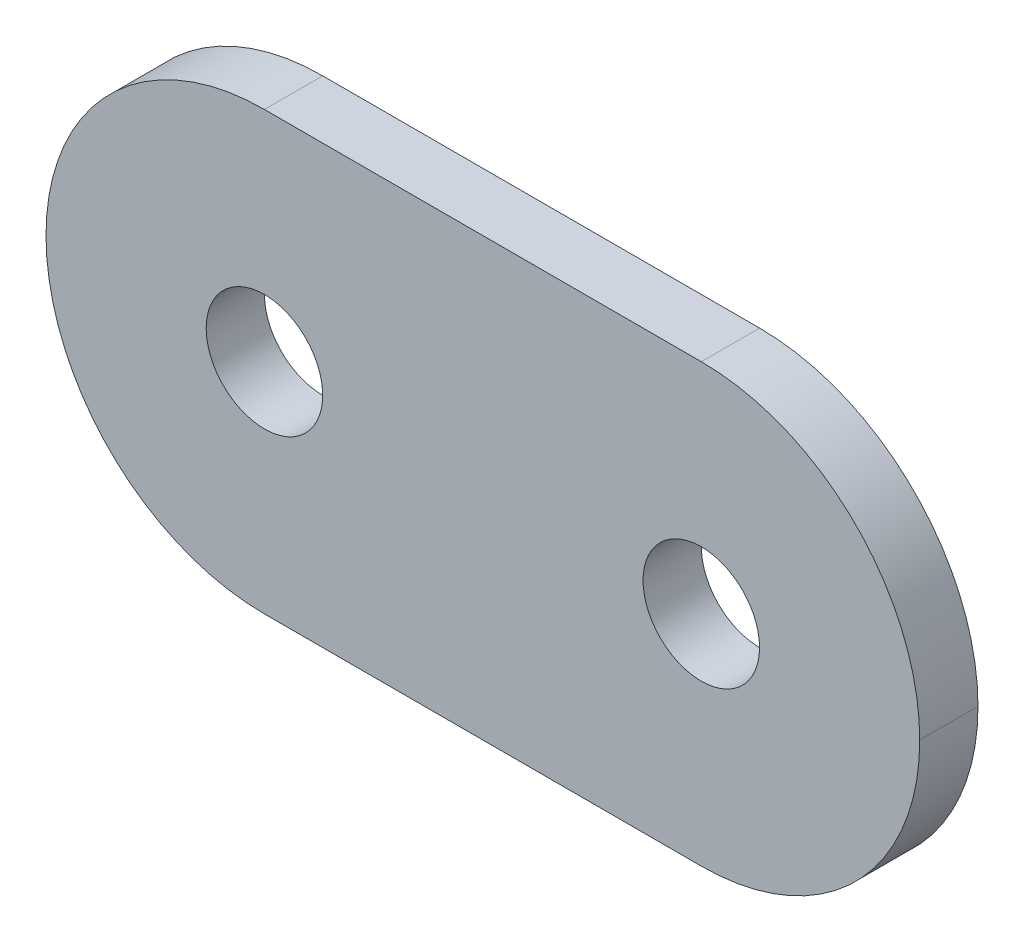
ISO-10303-21;
HEADER;
FILE_DESCRIPTION(('STEP AP214'),'2;1');
FILE_NAME('part.step','',(''),(''),'','','');
FILE_SCHEMA(('AUTOMOTIVE_DESIGN { 1 0 10303 214 1 1 1 1 }'));
ENDSEC;
DATA;
#1=APPLICATION_CONTEXT('core data for automotive mechanical design processes');
#2=APPLICATION_PROTOCOL_DEFINITION('international standard','automotive_design',2000,#1);
#3=PRODUCT_CONTEXT('',#1,'mechanical');
#4=PRODUCT('Part','Part','',(#3));
#5=PRODUCT_RELATED_PRODUCT_CATEGORY('part','',(#4));
#6=PRODUCT_DEFINITION_FORMATION('','',#4);
#7=PRODUCT_DEFINITION_CONTEXT('part definition',#1,'design');
#8=PRODUCT_DEFINITION('design','',#6,#7);
#9=PRODUCT_DEFINITION_SHAPE('','',#8);
#10=(LENGTH_UNIT() NAMED_UNIT(*) SI_UNIT(.MILLI.,.METRE.));
#11=(NAMED_UNIT(*) PLANE_ANGLE_UNIT() SI_UNIT($,.RADIAN.));
#12=(NAMED_UNIT(*) SI_UNIT($,.STERADIAN.) SOLID_ANGLE_UNIT());
#13=UNCERTAINTY_MEASURE_WITH_UNIT(LENGTH_MEASURE(1.E-05),#10,'distance_accuracy_value','');
#14=(GEOMETRIC_REPRESENTATION_CONTEXT(3) GLOBAL_UNCERTAINTY_ASSIGNED_CONTEXT((#13)) GLOBAL_UNIT_ASSIGNED_CONTEXT((#10,
#11,#12)) REPRESENTATION_CONTEXT('',''));
#15=CARTESIAN_POINT('',(0.,0.,0.));
#16=DIRECTION('',(0.,0.,1.));
#17=DIRECTION('',(1.,0.,0.));
#18=AXIS2_PLACEMENT_3D('',#15,#16,#17);
#19=CARTESIAN_POINT('',(-15.,7.5,2.));
#20=DIRECTION('',(0.,-1.,0.));
#21=DIRECTION('',(0.,0.,-1.));
#22=AXIS2_PLACEMENT_3D('',#19,#20,#21);
#23=PLANE('',#22);
#24=DIRECTION('',(-1.,0.,0.));
#25=VECTOR('',#24,1.);
#26=CARTESIAN_POINT('',(-15.,7.5,0.));
#27=LINE('',#26,#25);
#28=CARTESIAN_POINT('',(7.5,7.5,0.));
#29=VERTEX_POINT('',#28);
#30=CARTESIAN_POINT('',(-7.5,7.5,0.));
#31=VERTEX_POINT('',#30);
#32=EDGE_CURVE('E96',#29,#31,#27,.T.);
#33=ORIENTED_EDGE('',*,*,#32,.T.);
#34=DIRECTION('',(0.,0.,-1.));
#35=VECTOR('',#34,1.);
#36=CARTESIAN_POINT('',(-7.5,7.5,2.));
#37=LINE('',#36,#35);
#38=CARTESIAN_POINT('',(-7.5,7.5,2.));
#39=VERTEX_POINT('',#38);
#40=EDGE_CURVE('E11',#31,#39,#37,.F.);
#41=ORIENTED_EDGE('',*,*,#40,.T.);
#42=DIRECTION('',(-1.,0.,0.));
#43=VECTOR('',#42,1.);
#44=CARTESIAN_POINT('',(-15.,7.5,2.));
#45=LINE('',#44,#43);
#46=CARTESIAN_POINT('',(7.5,7.5,2.));
#47=VERTEX_POINT('',#46);
#48=EDGE_CURVE('E128',#47,#39,#45,.T.);
#49=ORIENTED_EDGE('',*,*,#48,.F.);
#50=DIRECTION('',(0.,0.,-1.));
#51=VECTOR('',#50,1.);
#52=CARTESIAN_POINT('',(7.5,7.5,2.));
#53=LINE('',#52,#51);
#54=EDGE_CURVE('E43',#47,#29,#53,.T.);
#55=ORIENTED_EDGE('',*,*,#54,.T.);
#56=EDGE_LOOP('',(#33,#41,#49,#55));
#57=FACE_BOUND('',#56,.T.);
#58=ADVANCED_FACE('F34',(#57),#23,.F.);
#59=CARTESIAN_POINT('',(-15.,-7.5,2.));
#60=DIRECTION('',(0.,1.,0.));
#61=DIRECTION('',(0.,0.,1.));
#62=AXIS2_PLACEMENT_3D('',#59,#60,#61);
#63=PLANE('',#62);
#64=DIRECTION('',(1.,0.,0.));
#65=VECTOR('',#64,1.);
#66=CARTESIAN_POINT('',(-15.,-7.5,0.));
#67=LINE('',#66,#65);
#68=CARTESIAN_POINT('',(-7.5,-7.5,0.));
#69=VERTEX_POINT('',#68);
#70=CARTESIAN_POINT('',(7.5,-7.5,0.));
#71=VERTEX_POINT('',#70);
#72=EDGE_CURVE('E129',#69,#71,#67,.T.);
#73=ORIENTED_EDGE('',*,*,#72,.T.);
#74=DIRECTION('',(0.,0.,-1.));
#75=VECTOR('',#74,1.);
#76=CARTESIAN_POINT('',(7.5,-7.5,2.));
#77=LINE('',#76,#75);
#78=CARTESIAN_POINT('',(7.5,-7.5,2.));
#79=VERTEX_POINT('',#78);
#80=EDGE_CURVE('E110',#71,#79,#77,.F.);
#81=ORIENTED_EDGE('',*,*,#80,.T.);
#82=DIRECTION('',(1.,0.,0.));
#83=VECTOR('',#82,1.);
#84=CARTESIAN_POINT('',(-15.,-7.5,2.));
#85=LINE('',#84,#83);
#86=CARTESIAN_POINT('',(-7.5,-7.5,2.));
#87=VERTEX_POINT('',#86);
#88=EDGE_CURVE('E99',#87,#79,#85,.T.);
#89=ORIENTED_EDGE('',*,*,#88,.F.);
#90=DIRECTION('',(0.,0.,-1.));
#91=VECTOR('',#90,1.);
#92=CARTESIAN_POINT('',(-7.5,-7.5,2.));
#93=LINE('',#92,#91);
#94=EDGE_CURVE('E118',#87,#69,#93,.T.);
#95=ORIENTED_EDGE('',*,*,#94,.T.);
#96=EDGE_LOOP('',(#73,#81,#89,#95));
#97=FACE_BOUND('',#96,.T.);
#98=ADVANCED_FACE('F160',(#97),#63,.F.);
#99=CARTESIAN_POINT('',(0.,0.,2.));
#100=DIRECTION('',(0.,0.,-1.));
#101=DIRECTION('',(-1.,0.,0.));
#102=AXIS2_PLACEMENT_3D('',#99,#100,#101);
#103=PLANE('',#102);
#104=CARTESIAN_POINT('',(-7.5,0.,2.));
#105=DIRECTION('',(0.,0.,1.));
#106=DIRECTION('',(-1.,0.,0.));
#107=AXIS2_PLACEMENT_3D('',#104,#105,#106);
#108=CIRCLE('',#107,2.);
#109=CARTESIAN_POINT('',(-9.5,0.,2.));
#110=VERTEX_POINT('',#109);
#111=EDGE_CURVE('E142',#110,#110,#108,.T.);
#112=ORIENTED_EDGE('',*,*,#111,.F.);
#113=EDGE_LOOP('',(#112));
#114=FACE_BOUND('',#113,.T.);
#115=CARTESIAN_POINT('',(7.5,0.,2.));
#116=DIRECTION('',(0.,0.,1.));
#117=DIRECTION('',(1.,0.,0.));
#118=AXIS2_PLACEMENT_3D('',#115,#116,#117);
#119=CIRCLE('',#118,2.);
#120=CARTESIAN_POINT('',(9.5,0.,2.));
#121=VERTEX_POINT('',#120);
#122=EDGE_CURVE('E134',#121,#121,#119,.T.);
#123=ORIENTED_EDGE('',*,*,#122,.F.);
#124=EDGE_LOOP('',(#123));
#125=FACE_BOUND('',#124,.T.);
#126=CARTESIAN_POINT('',(-7.5,0.,2.));
#127=DIRECTION('',(0.,0.,-1.));
#128=DIRECTION('',(-1.,0.,0.));
#129=AXIS2_PLACEMENT_3D('',#126,#127,#128);
#130=CIRCLE('',#129,7.5);
#131=CARTESIAN_POINT('',(-15.,0.,2.));
#132=VERTEX_POINT('',#131);
#133=EDGE_CURVE('E51',#39,#132,#130,.F.);
#134=ORIENTED_EDGE('',*,*,#133,.T.);
#135=CARTESIAN_POINT('',(-7.5,0.,2.));
#136=DIRECTION('',(0.,0.,-1.));
#137=DIRECTION('',(-1.,0.,0.));
#138=AXIS2_PLACEMENT_3D('',#135,#136,#137);
#139=CIRCLE('',#138,7.5);
#140=EDGE_CURVE('E126',#132,#87,#139,.F.);
#141=ORIENTED_EDGE('',*,*,#140,.T.);
#142=ORIENTED_EDGE('',*,*,#88,.T.);
#143=CARTESIAN_POINT('',(7.5,0.,2.));
#144=DIRECTION('',(0.,0.,-1.));
#145=DIRECTION('',(-1.,0.,0.));
#146=AXIS2_PLACEMENT_3D('',#143,#144,#145);
#147=CIRCLE('',#146,7.5);
#148=CARTESIAN_POINT('',(15.,0.,2.));
#149=VERTEX_POINT('',#148);
#150=EDGE_CURVE('E123',#79,#149,#147,.F.);
#151=ORIENTED_EDGE('',*,*,#150,.T.);
#152=CARTESIAN_POINT('',(7.5,0.,2.));
#153=DIRECTION('',(0.,0.,-1.));
#154=DIRECTION('',(-1.,0.,0.));
#155=AXIS2_PLACEMENT_3D('',#152,#153,#154);
#156=CIRCLE('',#155,7.5);
#157=EDGE_CURVE('E105',#149,#47,#156,.F.);
#158=ORIENTED_EDGE('',*,*,#157,.T.);
#159=ORIENTED_EDGE('',*,*,#48,.T.);
#160=EDGE_LOOP('',(#134,#141,#142,#151,#158,#159));
#161=FACE_BOUND('',#160,.T.);
#162=ADVANCED_FACE('F157',(#114,#125,#161),#103,.F.);
#163=CARTESIAN_POINT('',(0.,0.,0.));
#164=DIRECTION('',(0.,0.,-1.));
#165=DIRECTION('',(-1.,0.,0.));
#166=AXIS2_PLACEMENT_3D('',#163,#164,#165);
#167=PLANE('',#166);
#168=CARTESIAN_POINT('',(-7.5,0.,0.));
#169=DIRECTION('',(0.,0.,1.));
#170=DIRECTION('',(-1.,0.,0.));
#171=AXIS2_PLACEMENT_3D('',#168,#169,#170);
#172=CIRCLE('',#171,2.);
#173=CARTESIAN_POINT('',(-9.5,0.,0.));
#174=VERTEX_POINT('',#173);
#175=EDGE_CURVE('E139',#174,#174,#172,.T.);
#176=ORIENTED_EDGE('',*,*,#175,.T.);
#177=EDGE_LOOP('',(#176));
#178=FACE_BOUND('',#177,.T.);
#179=CARTESIAN_POINT('',(7.5,0.,0.));
#180=DIRECTION('',(0.,0.,1.));
#181=DIRECTION('',(1.,0.,0.));
#182=AXIS2_PLACEMENT_3D('',#179,#180,#181);
#183=CIRCLE('',#182,2.);
#184=CARTESIAN_POINT('',(9.5,0.,0.));
#185=VERTEX_POINT('',#184);
#186=EDGE_CURVE('E138',#185,#185,#183,.T.);
#187=ORIENTED_EDGE('',*,*,#186,.T.);
#188=EDGE_LOOP('',(#187));
#189=FACE_BOUND('',#188,.T.);
#190=ORIENTED_EDGE('',*,*,#72,.F.);
#191=CARTESIAN_POINT('',(-7.5,0.,0.));
#192=DIRECTION('',(0.,0.,-1.));
#193=DIRECTION('',(-1.,0.,0.));
#194=AXIS2_PLACEMENT_3D('',#191,#192,#193);
#195=CIRCLE('',#194,7.5);
#196=CARTESIAN_POINT('',(-15.,0.,0.));
#197=VERTEX_POINT('',#196);
#198=EDGE_CURVE('E113',#69,#197,#195,.T.);
#199=ORIENTED_EDGE('',*,*,#198,.T.);
#200=CARTESIAN_POINT('',(-7.5,0.,0.));
#201=DIRECTION('',(0.,0.,-1.));
#202=DIRECTION('',(-1.,0.,0.));
#203=AXIS2_PLACEMENT_3D('',#200,#201,#202);
#204=CIRCLE('',#203,7.5);
#205=EDGE_CURVE('E111',#197,#31,#204,.T.);
#206=ORIENTED_EDGE('',*,*,#205,.T.);
#207=ORIENTED_EDGE('',*,*,#32,.F.);
#208=CARTESIAN_POINT('',(7.5,0.,0.));
#209=DIRECTION('',(0.,0.,-1.));
#210=DIRECTION('',(-1.,0.,0.));
#211=AXIS2_PLACEMENT_3D('',#208,#209,#210);
#212=CIRCLE('',#211,7.5);
#213=CARTESIAN_POINT('',(15.,0.,0.));
#214=VERTEX_POINT('',#213);
#215=EDGE_CURVE('E89',#29,#214,#212,.T.);
#216=ORIENTED_EDGE('',*,*,#215,.T.);
#217=CARTESIAN_POINT('',(7.5,0.,0.));
#218=DIRECTION('',(0.,0.,-1.));
#219=DIRECTION('',(-1.,0.,0.));
#220=AXIS2_PLACEMENT_3D('',#217,#218,#219);
#221=CIRCLE('',#220,7.5);
#222=EDGE_CURVE('E94',#214,#71,#221,.T.);
#223=ORIENTED_EDGE('',*,*,#222,.T.);
#224=EDGE_LOOP('',(#190,#199,#206,#207,#216,#223));
#225=FACE_BOUND('',#224,.T.);
#226=ADVANCED_FACE('F92',(#178,#189,#225),#167,.T.);
#227=CARTESIAN_POINT('',(7.5,0.,2.));
#228=DIRECTION('',(0.,0.,-1.));
#229=DIRECTION('',(-1.,0.,0.));
#230=AXIS2_PLACEMENT_3D('',#227,#228,#229);
#231=CYLINDRICAL_SURFACE('',#230,7.5);
#232=ORIENTED_EDGE('',*,*,#54,.F.);
#233=ORIENTED_EDGE('',*,*,#157,.F.);
#234=DIRECTION('',(0.,0.,-1.));
#235=VECTOR('',#234,1.);
#236=CARTESIAN_POINT('',(15.,0.,2.));
#237=LINE('',#236,#235);
#238=EDGE_CURVE('E103',#214,#149,#237,.F.);
#239=ORIENTED_EDGE('',*,*,#238,.F.);
#240=ORIENTED_EDGE('',*,*,#215,.F.);
#241=EDGE_LOOP('',(#232,#233,#239,#240));
#242=FACE_BOUND('',#241,.T.);
#243=ADVANCED_FACE('F104',(#242),#231,.T.);
#244=CARTESIAN_POINT('',(7.5,0.,2.));
#245=DIRECTION('',(0.,0.,-1.));
#246=DIRECTION('',(-1.,0.,0.));
#247=AXIS2_PLACEMENT_3D('',#244,#245,#246);
#248=CYLINDRICAL_SURFACE('',#247,7.5);
#249=ORIENTED_EDGE('',*,*,#150,.F.);
#250=ORIENTED_EDGE('',*,*,#80,.F.);
#251=ORIENTED_EDGE('',*,*,#222,.F.);
#252=ORIENTED_EDGE('',*,*,#238,.T.);
#253=EDGE_LOOP('',(#249,#250,#251,#252));
#254=FACE_BOUND('',#253,.T.);
#255=ADVANCED_FACE('F108',(#254),#248,.T.);
#256=CARTESIAN_POINT('',(-7.5,0.,2.));
#257=DIRECTION('',(0.,0.,-1.));
#258=DIRECTION('',(-1.,0.,0.));
#259=AXIS2_PLACEMENT_3D('',#256,#257,#258);
#260=CYLINDRICAL_SURFACE('',#259,7.5);
#261=DIRECTION('',(0.,0.,-1.));
#262=VECTOR('',#261,1.);
#263=CARTESIAN_POINT('',(-15.,0.,2.));
#264=LINE('',#263,#262);
#265=EDGE_CURVE('E38',#132,#197,#264,.T.);
#266=ORIENTED_EDGE('',*,*,#265,.F.);
#267=ORIENTED_EDGE('',*,*,#133,.F.);
#268=ORIENTED_EDGE('',*,*,#40,.F.);
#269=ORIENTED_EDGE('',*,*,#205,.F.);
#270=EDGE_LOOP('',(#266,#267,#268,#269));
#271=FACE_BOUND('',#270,.T.);
#272=ADVANCED_FACE('F36',(#271),#260,.T.);
#273=CARTESIAN_POINT('',(-7.5,0.,2.));
#274=DIRECTION('',(0.,0.,-1.));
#275=DIRECTION('',(-1.,0.,0.));
#276=AXIS2_PLACEMENT_3D('',#273,#274,#275);
#277=CYLINDRICAL_SURFACE('',#276,7.5);
#278=ORIENTED_EDGE('',*,*,#140,.F.);
#279=ORIENTED_EDGE('',*,*,#265,.T.);
#280=ORIENTED_EDGE('',*,*,#198,.F.);
#281=ORIENTED_EDGE('',*,*,#94,.F.);
#282=EDGE_LOOP('',(#278,#279,#280,#281));
#283=FACE_BOUND('',#282,.T.);
#284=ADVANCED_FACE('F165',(#283),#277,.T.);
#285=CARTESIAN_POINT('',(7.5,0.,0.));
#286=DIRECTION('',(0.,0.,1.));
#287=DIRECTION('',(1.,0.,0.));
#288=AXIS2_PLACEMENT_3D('',#285,#286,#287);
#289=CYLINDRICAL_SURFACE('',#288,2.);
#290=ORIENTED_EDGE('',*,*,#186,.F.);
#291=EDGE_LOOP('',(#290));
#292=FACE_BOUND('',#291,.T.);
#293=ORIENTED_EDGE('',*,*,#122,.T.);
#294=EDGE_LOOP('',(#293));
#295=FACE_BOUND('',#294,.T.);
#296=ADVANCED_FACE('F153',(#292,#295),#289,.F.);
#297=CARTESIAN_POINT('',(-7.5,0.,0.));
#298=DIRECTION('',(0.,0.,1.));
#299=DIRECTION('',(1.,0.,0.));
#300=AXIS2_PLACEMENT_3D('',#297,#298,#299);
#301=CYLINDRICAL_SURFACE('',#300,2.);
#302=ORIENTED_EDGE('',*,*,#175,.F.);
#303=EDGE_LOOP('',(#302));
#304=FACE_BOUND('',#303,.T.);
#305=ORIENTED_EDGE('',*,*,#111,.T.);
#306=EDGE_LOOP('',(#305));
#307=FACE_BOUND('',#306,.T.);
#308=ADVANCED_FACE('F150',(#304,#307),#301,.F.);
#309=CLOSED_SHELL('',(#58,#98,#162,#226,#243,#255,#272,#284,#296,#308));
#310=MANIFOLD_SOLID_BREP('B2',#309);
#311=ADVANCED_BREP_SHAPE_REPRESENTATION('',(#18,#310),#14);
#312=SHAPE_DEFINITION_REPRESENTATION(#9,#311);
ENDSEC;
END-ISO-10303-21;
